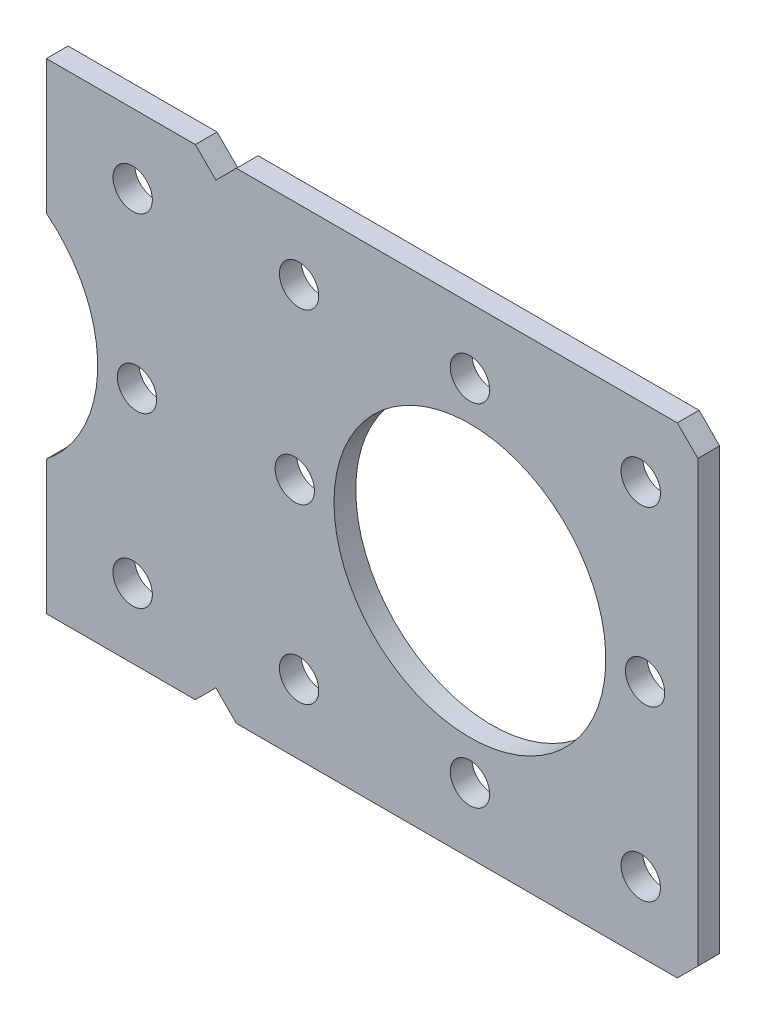
ISO-10303-21;
HEADER;
FILE_DESCRIPTION(('STEP AP214'),'2;1');
FILE_NAME('part.step','',(''),(''),'','','');
FILE_SCHEMA(('AUTOMOTIVE_DESIGN { 1 0 10303 214 1 1 1 1 }'));
ENDSEC;
DATA;
#1=APPLICATION_CONTEXT('core data for automotive mechanical design processes');
#2=APPLICATION_PROTOCOL_DEFINITION('international standard','automotive_design',2000,#1);
#3=PRODUCT_CONTEXT('',#1,'mechanical');
#4=PRODUCT('Part','Part','',(#3));
#5=PRODUCT_RELATED_PRODUCT_CATEGORY('part','',(#4));
#6=PRODUCT_DEFINITION_FORMATION('','',#4);
#7=PRODUCT_DEFINITION_CONTEXT('part definition',#1,'design');
#8=PRODUCT_DEFINITION('design','',#6,#7);
#9=PRODUCT_DEFINITION_SHAPE('','',#8);
#10=(LENGTH_UNIT() NAMED_UNIT(*) SI_UNIT(.MILLI.,.METRE.));
#11=(NAMED_UNIT(*) PLANE_ANGLE_UNIT() SI_UNIT($,.RADIAN.));
#12=(NAMED_UNIT(*) SI_UNIT($,.STERADIAN.) SOLID_ANGLE_UNIT());
#13=UNCERTAINTY_MEASURE_WITH_UNIT(LENGTH_MEASURE(1.E-05),#10,'distance_accuracy_value','');
#14=(GEOMETRIC_REPRESENTATION_CONTEXT(3) GLOBAL_UNCERTAINTY_ASSIGNED_CONTEXT((#13)) GLOBAL_UNIT_ASSIGNED_CONTEXT((#10,
#11,#12)) REPRESENTATION_CONTEXT('',''));
#15=CARTESIAN_POINT('',(0.,0.,0.));
#16=DIRECTION('',(0.,0.,1.));
#17=DIRECTION('',(1.,0.,0.));
#18=AXIS2_PLACEMENT_3D('',#15,#16,#17);
#19=CARTESIAN_POINT('',(-50.673,-25.273,2.286));
#20=DIRECTION('',(0.,0.,1.));
#21=DIRECTION('',(1.,0.,0.));
#22=AXIS2_PLACEMENT_3D('',#19,#20,#21);
#23=PLANE('',#22);
#24=DIRECTION('',(1.,0.,0.));
#25=VECTOR('',#24,1.);
#26=CARTESIAN_POINT('',(-50.673,25.273,2.286));
#27=LINE('',#26,#25);
#28=CARTESIAN_POINT('',(-2.159,25.273,2.286));
#29=VERTEX_POINT('',#28);
#30=CARTESIAN_POINT('',(-17.8181,25.273,2.286));
#31=VERTEX_POINT('',#30);
#32=EDGE_CURVE('E183',#29,#31,#27,.F.);
#33=ORIENTED_EDGE('',*,*,#32,.T.);
#34=DIRECTION('',(0.,1.,0.));
#35=VECTOR('',#34,1.);
#36=CARTESIAN_POINT('',(-17.8181,-25.273,2.286));
#37=LINE('',#36,#35);
#38=CARTESIAN_POINT('',(-17.8181,11.1848359956684,2.286));
#39=VERTEX_POINT('',#38);
#40=EDGE_CURVE('E47',#31,#39,#37,.F.);
#41=ORIENTED_EDGE('',*,*,#40,.T.);
#42=CARTESIAN_POINT('',(-26.7081,0.,2.286));
#43=DIRECTION('',(0.,0.,-1.));
#44=DIRECTION('',(-1.,0.,0.));
#45=AXIS2_PLACEMENT_3D('',#42,#43,#44);
#46=CIRCLE('',#45,14.2875);
#47=CARTESIAN_POINT('',(-17.8181,-11.1848359956684,2.286));
#48=VERTEX_POINT('',#47);
#49=EDGE_CURVE('E162',#39,#48,#46,.T.);
#50=ORIENTED_EDGE('',*,*,#49,.T.);
#51=DIRECTION('',(0.,1.,0.));
#52=VECTOR('',#51,1.);
#53=CARTESIAN_POINT('',(-17.8181,-25.273,2.286));
#54=LINE('',#53,#52);
#55=CARTESIAN_POINT('',(-17.8181,-25.273,2.286));
#56=VERTEX_POINT('',#55);
#57=EDGE_CURVE('E143',#48,#56,#54,.F.);
#58=ORIENTED_EDGE('',*,*,#57,.T.);
#59=DIRECTION('',(1.,0.,0.));
#60=VECTOR('',#59,1.);
#61=CARTESIAN_POINT('',(-50.673,-25.273,2.286));
#62=LINE('',#61,#60);
#63=CARTESIAN_POINT('',(-2.159,-25.273,2.286));
#64=VERTEX_POINT('',#63);
#65=EDGE_CURVE('E122',#56,#64,#62,.T.);
#66=ORIENTED_EDGE('',*,*,#65,.T.);
#67=DIRECTION('',(-0.707106781186546,-0.707106781186549,0.));
#68=VECTOR('',#67,1.);
#69=CARTESIAN_POINT('',(-2.159,-25.273,2.286));
#70=LINE('',#69,#68);
#71=CARTESIAN_POINT('',(0.,-23.114,2.286));
#72=VERTEX_POINT('',#71);
#73=EDGE_CURVE('E278',#64,#72,#70,.F.);
#74=ORIENTED_EDGE('',*,*,#73,.T.);
#75=DIRECTION('',(-0.707106781186546,0.707106781186549,0.));
#76=VECTOR('',#75,1.);
#77=CARTESIAN_POINT('',(0.,-23.114,2.286));
#78=LINE('',#77,#76);
#79=CARTESIAN_POINT('',(2.159,-25.273,2.286));
#80=VERTEX_POINT('',#79);
#81=EDGE_CURVE('E261',#72,#80,#78,.F.);
#82=ORIENTED_EDGE('',*,*,#81,.T.);
#83=DIRECTION('',(1.,0.,0.));
#84=VECTOR('',#83,1.);
#85=CARTESIAN_POINT('',(-50.673,-25.273,2.286));
#86=LINE('',#85,#84);
#87=CARTESIAN_POINT('',(48.514,-25.273,2.286));
#88=VERTEX_POINT('',#87);
#89=EDGE_CURVE('E260',#80,#88,#86,.T.);
#90=ORIENTED_EDGE('',*,*,#89,.T.);
#91=DIRECTION('',(-0.707106781186548,-0.707106781186548,0.));
#92=VECTOR('',#91,1.);
#93=CARTESIAN_POINT('',(50.673,-23.114,2.286));
#94=LINE('',#93,#92);
#95=CARTESIAN_POINT('',(50.673,-23.114,2.286));
#96=VERTEX_POINT('',#95);
#97=EDGE_CURVE('E249',#88,#96,#94,.F.);
#98=ORIENTED_EDGE('',*,*,#97,.T.);
#99=DIRECTION('',(0.,1.,0.));
#100=VECTOR('',#99,1.);
#101=CARTESIAN_POINT('',(50.673,25.273,2.286));
#102=LINE('',#101,#100);
#103=CARTESIAN_POINT('',(50.673,23.114,2.286));
#104=VERTEX_POINT('',#103);
#105=EDGE_CURVE('E238',#96,#104,#102,.T.);
#106=ORIENTED_EDGE('',*,*,#105,.T.);
#107=DIRECTION('',(0.707106781186548,-0.707106781186548,0.));
#108=VECTOR('',#107,1.);
#109=CARTESIAN_POINT('',(48.514,25.273,2.286));
#110=LINE('',#109,#108);
#111=CARTESIAN_POINT('',(48.514,25.273,2.286));
#112=VERTEX_POINT('',#111);
#113=EDGE_CURVE('E227',#104,#112,#110,.F.);
#114=ORIENTED_EDGE('',*,*,#113,.T.);
#115=DIRECTION('',(1.,0.,0.));
#116=VECTOR('',#115,1.);
#117=CARTESIAN_POINT('',(-50.673,25.273,2.286));
#118=LINE('',#117,#116);
#119=CARTESIAN_POINT('',(2.15899999999999,25.273,2.286));
#120=VERTEX_POINT('',#119);
#121=EDGE_CURVE('E216',#112,#120,#118,.F.);
#122=ORIENTED_EDGE('',*,*,#121,.T.);
#123=DIRECTION('',(0.707106781186546,0.707106781186549,0.));
#124=VECTOR('',#123,1.);
#125=CARTESIAN_POINT('',(0.,23.114,2.286));
#126=LINE('',#125,#124);
#127=CARTESIAN_POINT('',(0.,23.114,2.286));
#128=VERTEX_POINT('',#127);
#129=EDGE_CURVE('E205',#120,#128,#126,.F.);
#130=ORIENTED_EDGE('',*,*,#129,.T.);
#131=DIRECTION('',(0.707106781186546,-0.707106781186549,0.));
#132=VECTOR('',#131,1.);
#133=CARTESIAN_POINT('',(-2.159,25.273,2.286));
#134=LINE('',#133,#132);
#135=EDGE_CURVE('E184',#128,#29,#134,.F.);
#136=ORIENTED_EDGE('',*,*,#135,.T.);
#137=EDGE_LOOP('',(#33,#41,#50,#58,#66,#74,#82,#90,#98,#106,#114,#122,#130,#136));
#138=FACE_BOUND('',#137,.T.);
#139=CARTESIAN_POINT('',(26.7081,-18.415,2.286));
#140=DIRECTION('',(0.,0.,-1.));
#141=DIRECTION('',(-1.,0.,0.));
#142=AXIS2_PLACEMENT_3D('',#139,#140,#141);
#143=CIRCLE('',#142,2.0701);
#144=CARTESIAN_POINT('',(24.638,-18.415,2.286));
#145=VERTEX_POINT('',#144);
#146=EDGE_CURVE('E351',#145,#145,#143,.T.);
#147=ORIENTED_EDGE('',*,*,#146,.T.);
#148=EDGE_LOOP('',(#147));
#149=FACE_BOUND('',#148,.T.);
#150=CARTESIAN_POINT('',(-8.2931,-1.87350135405495E-13,2.286));
#151=DIRECTION('',(0.,0.,-1.));
#152=DIRECTION('',(-1.,0.,0.));
#153=AXIS2_PLACEMENT_3D('',#150,#151,#152);
#154=CIRCLE('',#153,2.0701);
#155=CARTESIAN_POINT('',(-10.3632,-1.87350135405495E-13,2.286));
#156=VERTEX_POINT('',#155);
#157=EDGE_CURVE('E354',#156,#156,#154,.T.);
#158=ORIENTED_EDGE('',*,*,#157,.T.);
#159=EDGE_LOOP('',(#158));
#160=FACE_BOUND('',#159,.T.);
#161=CARTESIAN_POINT('',(8.2931,-1.7347234759768E-13,2.286));
#162=DIRECTION('',(0.,0.,-1.));
#163=DIRECTION('',(-1.,0.,0.));
#164=AXIS2_PLACEMENT_3D('',#161,#162,#163);
#165=CIRCLE('',#164,2.0701);
#166=CARTESIAN_POINT('',(6.223,-1.7347234759768E-13,2.286));
#167=VERTEX_POINT('',#166);
#168=EDGE_CURVE('E357',#167,#167,#165,.T.);
#169=ORIENTED_EDGE('',*,*,#168,.T.);
#170=EDGE_LOOP('',(#169));
#171=FACE_BOUND('',#170,.T.);
#172=CARTESIAN_POINT('',(-8.7475877578617,-17.9605122421383,2.286));
#173=DIRECTION('',(0.,0.,-1.));
#174=DIRECTION('',(-1.,0.,0.));
#175=AXIS2_PLACEMENT_3D('',#172,#173,#174);
#176=CIRCLE('',#175,2.0701);
#177=CARTESIAN_POINT('',(-10.8176877578617,-17.9605122421383,2.286));
#178=VERTEX_POINT('',#177);
#179=EDGE_CURVE('E360',#178,#178,#176,.T.);
#180=ORIENTED_EDGE('',*,*,#179,.T.);
#181=EDGE_LOOP('',(#180));
#182=FACE_BOUND('',#181,.T.);
#183=CARTESIAN_POINT('',(44.6686122421383,17.9605122421382,2.286));
#184=DIRECTION('',(0.,0.,-1.));
#185=DIRECTION('',(-1.,0.,0.));
#186=AXIS2_PLACEMENT_3D('',#183,#184,#185);
#187=CIRCLE('',#186,2.0701);
#188=CARTESIAN_POINT('',(42.5985122421383,17.9605122421382,2.286));
#189=VERTEX_POINT('',#188);
#190=EDGE_CURVE('E363',#189,#189,#187,.T.);
#191=ORIENTED_EDGE('',*,*,#190,.T.);
#192=EDGE_LOOP('',(#191));
#193=FACE_BOUND('',#192,.T.);
#194=CARTESIAN_POINT('',(8.74758775786161,-17.9605122421383,2.286));
#195=DIRECTION('',(0.,0.,-1.));
#196=DIRECTION('',(-1.,0.,0.));
#197=AXIS2_PLACEMENT_3D('',#194,#195,#196);
#198=CIRCLE('',#197,2.0701);
#199=CARTESIAN_POINT('',(6.67748775786161,-17.9605122421383,2.286));
#200=VERTEX_POINT('',#199);
#201=EDGE_CURVE('E366',#200,#200,#198,.T.);
#202=ORIENTED_EDGE('',*,*,#201,.T.);
#203=EDGE_LOOP('',(#202));
#204=FACE_BOUND('',#203,.T.);
#205=CARTESIAN_POINT('',(26.7081,0.,2.286));
#206=DIRECTION('',(0.,0.,-1.));
#207=DIRECTION('',(-1.,0.,0.));
#208=AXIS2_PLACEMENT_3D('',#205,#206,#207);
#209=CIRCLE('',#208,14.2875);
#210=CARTESIAN_POINT('',(12.4206,0.,2.286));
#211=VERTEX_POINT('',#210);
#212=EDGE_CURVE('E369',#211,#211,#209,.T.);
#213=ORIENTED_EDGE('',*,*,#212,.T.);
#214=EDGE_LOOP('',(#213));
#215=FACE_BOUND('',#214,.T.);
#216=CARTESIAN_POINT('',(8.74758775786166,17.9605122421383,2.286));
#217=DIRECTION('',(0.,0.,-1.));
#218=DIRECTION('',(-1.,0.,0.));
#219=AXIS2_PLACEMENT_3D('',#216,#217,#218);
#220=CIRCLE('',#219,2.0701);
#221=CARTESIAN_POINT('',(6.67748775786166,17.9605122421383,2.286));
#222=VERTEX_POINT('',#221);
#223=EDGE_CURVE('E372',#222,#222,#220,.T.);
#224=ORIENTED_EDGE('',*,*,#223,.T.);
#225=EDGE_LOOP('',(#224));
#226=FACE_BOUND('',#225,.T.);
#227=CARTESIAN_POINT('',(44.6686122421383,-17.9605122421383,2.286));
#228=DIRECTION('',(0.,0.,-1.));
#229=DIRECTION('',(-1.,0.,0.));
#230=AXIS2_PLACEMENT_3D('',#227,#228,#229);
#231=CIRCLE('',#230,2.0701);
#232=CARTESIAN_POINT('',(42.5985122421383,-17.9605122421383,2.286));
#233=VERTEX_POINT('',#232);
#234=EDGE_CURVE('E142',#233,#233,#231,.T.);
#235=ORIENTED_EDGE('',*,*,#234,.T.);
#236=EDGE_LOOP('',(#235));
#237=FACE_BOUND('',#236,.T.);
#238=CARTESIAN_POINT('',(-8.74758775786172,17.9605122421383,2.286));
#239=DIRECTION('',(0.,0.,-1.));
#240=DIRECTION('',(-1.,0.,0.));
#241=AXIS2_PLACEMENT_3D('',#238,#239,#240);
#242=CIRCLE('',#241,2.0701);
#243=CARTESIAN_POINT('',(-10.8176877578617,17.9605122421383,2.286));
#244=VERTEX_POINT('',#243);
#245=EDGE_CURVE('E282',#244,#244,#242,.T.);
#246=ORIENTED_EDGE('',*,*,#245,.T.);
#247=EDGE_LOOP('',(#246));
#248=FACE_BOUND('',#247,.T.);
#249=CARTESIAN_POINT('',(26.7081,18.415,2.286));
#250=DIRECTION('',(0.,0.,-1.));
#251=DIRECTION('',(-1.,0.,0.));
#252=AXIS2_PLACEMENT_3D('',#249,#250,#251);
#253=CIRCLE('',#252,2.0701);
#254=CARTESIAN_POINT('',(24.638,18.415,2.286));
#255=VERTEX_POINT('',#254);
#256=EDGE_CURVE('E379',#255,#255,#253,.T.);
#257=ORIENTED_EDGE('',*,*,#256,.T.);
#258=EDGE_LOOP('',(#257));
#259=FACE_BOUND('',#258,.T.);
#260=CARTESIAN_POINT('',(45.1231,0.,2.286));
#261=DIRECTION('',(0.,0.,-1.));
#262=DIRECTION('',(-1.,0.,0.));
#263=AXIS2_PLACEMENT_3D('',#260,#261,#262);
#264=CIRCLE('',#263,2.0701);
#265=CARTESIAN_POINT('',(43.053,0.,2.286));
#266=VERTEX_POINT('',#265);
#267=EDGE_CURVE('E19',#266,#266,#264,.T.);
#268=ORIENTED_EDGE('',*,*,#267,.T.);
#269=EDGE_LOOP('',(#268));
#270=FACE_BOUND('',#269,.T.);
#271=ADVANCED_FACE('F16',(#138,#149,#160,#171,#182,#193,#204,#215,#226,#237,#248,#259,#270),#23,.T.);
#272=CARTESIAN_POINT('',(45.1231,0.,2.286));
#273=DIRECTION('',(0.,0.,-1.));
#274=DIRECTION('',(-1.,0.,0.));
#275=AXIS2_PLACEMENT_3D('',#272,#273,#274);
#276=CYLINDRICAL_SURFACE('',#275,2.0701);
#277=CARTESIAN_POINT('',(45.1231,0.,0.));
#278=DIRECTION('',(0.,0.,-1.));
#279=DIRECTION('',(-1.,0.,0.));
#280=AXIS2_PLACEMENT_3D('',#277,#278,#279);
#281=CIRCLE('',#280,2.0701);
#282=CARTESIAN_POINT('',(43.053,0.,0.));
#283=VERTEX_POINT('',#282);
#284=EDGE_CURVE('E348',#283,#283,#281,.T.);
#285=ORIENTED_EDGE('',*,*,#284,.T.);
#286=EDGE_LOOP('',(#285));
#287=FACE_BOUND('',#286,.T.);
#288=ORIENTED_EDGE('',*,*,#267,.F.);
#289=EDGE_LOOP('',(#288));
#290=FACE_BOUND('',#289,.T.);
#291=ADVANCED_FACE('F387',(#287,#290),#276,.F.);
#292=CARTESIAN_POINT('',(26.7081,18.415,2.286));
#293=DIRECTION('',(0.,0.,-1.));
#294=DIRECTION('',(-1.,0.,0.));
#295=AXIS2_PLACEMENT_3D('',#292,#293,#294);
#296=CYLINDRICAL_SURFACE('',#295,2.0701);
#297=CARTESIAN_POINT('',(26.7081,18.415,0.));
#298=DIRECTION('',(0.,0.,-1.));
#299=DIRECTION('',(-1.,0.,0.));
#300=AXIS2_PLACEMENT_3D('',#297,#298,#299);
#301=CIRCLE('',#300,2.0701);
#302=CARTESIAN_POINT('',(24.638,18.415,0.));
#303=VERTEX_POINT('',#302);
#304=EDGE_CURVE('E345',#303,#303,#301,.T.);
#305=ORIENTED_EDGE('',*,*,#304,.T.);
#306=EDGE_LOOP('',(#305));
#307=FACE_BOUND('',#306,.T.);
#308=ORIENTED_EDGE('',*,*,#256,.F.);
#309=EDGE_LOOP('',(#308));
#310=FACE_BOUND('',#309,.T.);
#311=ADVANCED_FACE('F389',(#307,#310),#296,.F.);
#312=CARTESIAN_POINT('',(-8.74758775786172,17.9605122421383,2.286));
#313=DIRECTION('',(0.,0.,-1.));
#314=DIRECTION('',(-1.,0.,0.));
#315=AXIS2_PLACEMENT_3D('',#312,#313,#314);
#316=CYLINDRICAL_SURFACE('',#315,2.0701);
#317=CARTESIAN_POINT('',(-8.74758775786172,17.9605122421383,0.));
#318=DIRECTION('',(0.,0.,-1.));
#319=DIRECTION('',(-1.,0.,0.));
#320=AXIS2_PLACEMENT_3D('',#317,#318,#319);
#321=CIRCLE('',#320,2.0701);
#322=CARTESIAN_POINT('',(-10.8176877578617,17.9605122421383,0.));
#323=VERTEX_POINT('',#322);
#324=EDGE_CURVE('E137',#323,#323,#321,.T.);
#325=ORIENTED_EDGE('',*,*,#324,.T.);
#326=EDGE_LOOP('',(#325));
#327=FACE_BOUND('',#326,.T.);
#328=ORIENTED_EDGE('',*,*,#245,.F.);
#329=EDGE_LOOP('',(#328));
#330=FACE_BOUND('',#329,.T.);
#331=ADVANCED_FACE('F396',(#327,#330),#316,.F.);
#332=CARTESIAN_POINT('',(-50.673,-25.273,2.286));
#333=DIRECTION('',(0.,1.,0.));
#334=DIRECTION('',(0.,0.,1.));
#335=AXIS2_PLACEMENT_3D('',#332,#333,#334);
#336=PLANE('',#335);
#337=DIRECTION('',(1.,0.,0.));
#338=VECTOR('',#337,1.);
#339=CARTESIAN_POINT('',(-50.673,-25.273,0.));
#340=LINE('',#339,#338);
#341=CARTESIAN_POINT('',(-17.8181,-25.273,0.));
#342=VERTEX_POINT('',#341);
#343=CARTESIAN_POINT('',(-2.15900000000001,-25.273,0.));
#344=VERTEX_POINT('',#343);
#345=EDGE_CURVE('E128',#342,#344,#340,.T.);
#346=ORIENTED_EDGE('',*,*,#345,.T.);
#347=DIRECTION('',(0.,0.,1.));
#348=VECTOR('',#347,1.);
#349=CARTESIAN_POINT('',(-2.159,-25.273,2.286));
#350=LINE('',#349,#348);
#351=EDGE_CURVE('E271',#344,#64,#350,.T.);
#352=ORIENTED_EDGE('',*,*,#351,.T.);
#353=ORIENTED_EDGE('',*,*,#65,.F.);
#354=DIRECTION('',(0.,0.,-1.));
#355=VECTOR('',#354,1.);
#356=CARTESIAN_POINT('',(-17.8181,-25.273,0.));
#357=LINE('',#356,#355);
#358=EDGE_CURVE('E139',#56,#342,#357,.T.);
#359=ORIENTED_EDGE('',*,*,#358,.T.);
#360=EDGE_LOOP('',(#346,#352,#353,#359));
#361=FACE_BOUND('',#360,.T.);
#362=ADVANCED_FACE('F140',(#361),#336,.F.);
#363=CARTESIAN_POINT('',(-2.159,-25.273,2.286));
#364=DIRECTION('',(-0.707106781186549,0.707106781186546,0.));
#365=DIRECTION('',(-0.707106781186546,-0.707106781186549,0.));
#366=AXIS2_PLACEMENT_3D('',#363,#364,#365);
#367=PLANE('',#366);
#368=DIRECTION('',(0.707106781186547,0.707106781186548,0.));
#369=VECTOR('',#368,1.);
#370=CARTESIAN_POINT('',(-2.159,-25.273,0.));
#371=LINE('',#370,#369);
#372=CARTESIAN_POINT('',(0.,-23.114,0.));
#373=VERTEX_POINT('',#372);
#374=EDGE_CURVE('E136',#344,#373,#371,.T.);
#375=ORIENTED_EDGE('',*,*,#374,.T.);
#376=DIRECTION('',(0.,0.,1.));
#377=VECTOR('',#376,1.);
#378=CARTESIAN_POINT('',(0.,-23.114,2.286));
#379=LINE('',#378,#377);
#380=EDGE_CURVE('E268',#373,#72,#379,.T.);
#381=ORIENTED_EDGE('',*,*,#380,.T.);
#382=ORIENTED_EDGE('',*,*,#73,.F.);
#383=ORIENTED_EDGE('',*,*,#351,.F.);
#384=EDGE_LOOP('',(#375,#381,#382,#383));
#385=FACE_BOUND('',#384,.T.);
#386=ADVANCED_FACE('F488',(#385),#367,.F.);
#387=CARTESIAN_POINT('',(0.,-23.114,2.286));
#388=DIRECTION('',(0.707106781186549,0.707106781186546,0.));
#389=DIRECTION('',(-0.707106781186546,0.707106781186549,0.));
#390=AXIS2_PLACEMENT_3D('',#387,#388,#389);
#391=PLANE('',#390);
#392=ORIENTED_EDGE('',*,*,#380,.F.);
#393=DIRECTION('',(0.707106781186546,-0.707106781186549,0.));
#394=VECTOR('',#393,1.);
#395=CARTESIAN_POINT('',(0.,-23.114,0.));
#396=LINE('',#395,#394);
#397=CARTESIAN_POINT('',(2.159,-25.273,0.));
#398=VERTEX_POINT('',#397);
#399=EDGE_CURVE('E254',#373,#398,#396,.T.);
#400=ORIENTED_EDGE('',*,*,#399,.T.);
#401=DIRECTION('',(0.,0.,1.));
#402=VECTOR('',#401,1.);
#403=CARTESIAN_POINT('',(2.159,-25.273,2.286));
#404=LINE('',#403,#402);
#405=EDGE_CURVE('E257',#398,#80,#404,.T.);
#406=ORIENTED_EDGE('',*,*,#405,.T.);
#407=ORIENTED_EDGE('',*,*,#81,.F.);
#408=EDGE_LOOP('',(#392,#400,#406,#407));
#409=FACE_BOUND('',#408,.T.);
#410=ADVANCED_FACE('F484',(#409),#391,.F.);
#411=CARTESIAN_POINT('',(-50.673,-25.273,2.286));
#412=DIRECTION('',(0.,1.,0.));
#413=DIRECTION('',(0.,0.,1.));
#414=AXIS2_PLACEMENT_3D('',#411,#412,#413);
#415=PLANE('',#414);
#416=DIRECTION('',(0.,0.,1.));
#417=VECTOR('',#416,1.);
#418=CARTESIAN_POINT('',(48.514,-25.273,2.286));
#419=LINE('',#418,#417);
#420=CARTESIAN_POINT('',(48.514,-25.273,0.));
#421=VERTEX_POINT('',#420);
#422=EDGE_CURVE('E239',#421,#88,#419,.T.);
#423=ORIENTED_EDGE('',*,*,#422,.T.);
#424=ORIENTED_EDGE('',*,*,#89,.F.);
#425=ORIENTED_EDGE('',*,*,#405,.F.);
#426=DIRECTION('',(1.,0.,0.));
#427=VECTOR('',#426,1.);
#428=CARTESIAN_POINT('',(-50.673,-25.273,0.));
#429=LINE('',#428,#427);
#430=EDGE_CURVE('E244',#398,#421,#429,.T.);
#431=ORIENTED_EDGE('',*,*,#430,.T.);
#432=EDGE_LOOP('',(#423,#424,#425,#431));
#433=FACE_BOUND('',#432,.T.);
#434=ADVANCED_FACE('F480',(#433),#415,.F.);
#435=CARTESIAN_POINT('',(50.673,-23.114,2.286));
#436=DIRECTION('',(-0.707106781186548,0.707106781186548,0.));
#437=DIRECTION('',(-0.707106781186548,-0.707106781186548,0.));
#438=AXIS2_PLACEMENT_3D('',#435,#436,#437);
#439=PLANE('',#438);
#440=DIRECTION('',(0.707106781186548,0.707106781186547,0.));
#441=VECTOR('',#440,1.);
#442=CARTESIAN_POINT('',(48.514,-25.273,0.));
#443=LINE('',#442,#441);
#444=CARTESIAN_POINT('',(50.673,-23.114,0.));
#445=VERTEX_POINT('',#444);
#446=EDGE_CURVE('E232',#421,#445,#443,.T.);
#447=ORIENTED_EDGE('',*,*,#446,.T.);
#448=DIRECTION('',(0.,0.,1.));
#449=VECTOR('',#448,1.);
#450=CARTESIAN_POINT('',(50.673,-23.114,2.286));
#451=LINE('',#450,#449);
#452=EDGE_CURVE('E235',#445,#96,#451,.T.);
#453=ORIENTED_EDGE('',*,*,#452,.T.);
#454=ORIENTED_EDGE('',*,*,#97,.F.);
#455=ORIENTED_EDGE('',*,*,#422,.F.);
#456=EDGE_LOOP('',(#447,#453,#454,#455));
#457=FACE_BOUND('',#456,.T.);
#458=ADVANCED_FACE('F476',(#457),#439,.F.);
#459=CARTESIAN_POINT('',(50.673,25.273,2.286));
#460=DIRECTION('',(-1.,0.,0.));
#461=DIRECTION('',(0.,0.,1.));
#462=AXIS2_PLACEMENT_3D('',#459,#460,#461);
#463=PLANE('',#462);
#464=ORIENTED_EDGE('',*,*,#105,.F.);
#465=ORIENTED_EDGE('',*,*,#452,.F.);
#466=DIRECTION('',(0.,1.,0.));
#467=VECTOR('',#466,1.);
#468=CARTESIAN_POINT('',(50.673,-25.273,0.));
#469=LINE('',#468,#467);
#470=CARTESIAN_POINT('',(50.673,23.114,0.));
#471=VERTEX_POINT('',#470);
#472=EDGE_CURVE('E222',#445,#471,#469,.T.);
#473=ORIENTED_EDGE('',*,*,#472,.T.);
#474=DIRECTION('',(0.,0.,1.));
#475=VECTOR('',#474,1.);
#476=CARTESIAN_POINT('',(50.673,23.114,2.286));
#477=LINE('',#476,#475);
#478=EDGE_CURVE('E217',#471,#104,#477,.T.);
#479=ORIENTED_EDGE('',*,*,#478,.T.);
#480=EDGE_LOOP('',(#464,#465,#473,#479));
#481=FACE_BOUND('',#480,.T.);
#482=ADVANCED_FACE('F472',(#481),#463,.F.);
#483=CARTESIAN_POINT('',(48.514,25.273,2.286));
#484=DIRECTION('',(-0.707106781186548,-0.707106781186548,0.));
#485=DIRECTION('',(0.707106781186548,-0.707106781186548,0.));
#486=AXIS2_PLACEMENT_3D('',#483,#484,#485);
#487=PLANE('',#486);
#488=DIRECTION('',(-0.707106781186548,0.707106781186548,0.));
#489=VECTOR('',#488,1.);
#490=CARTESIAN_POINT('',(50.673,23.114,0.));
#491=LINE('',#490,#489);
#492=CARTESIAN_POINT('',(48.514,25.273,0.));
#493=VERTEX_POINT('',#492);
#494=EDGE_CURVE('E210',#471,#493,#491,.T.);
#495=ORIENTED_EDGE('',*,*,#494,.T.);
#496=DIRECTION('',(0.,0.,-1.));
#497=VECTOR('',#496,1.);
#498=CARTESIAN_POINT('',(48.514,25.273,2.286));
#499=LINE('',#498,#497);
#500=EDGE_CURVE('E213',#493,#112,#499,.F.);
#501=ORIENTED_EDGE('',*,*,#500,.T.);
#502=ORIENTED_EDGE('',*,*,#113,.F.);
#503=ORIENTED_EDGE('',*,*,#478,.F.);
#504=EDGE_LOOP('',(#495,#501,#502,#503));
#505=FACE_BOUND('',#504,.T.);
#506=ADVANCED_FACE('F468',(#505),#487,.F.);
#507=CARTESIAN_POINT('',(-50.673,25.273,2.286));
#508=DIRECTION('',(0.,-1.,0.));
#509=DIRECTION('',(0.,0.,-1.));
#510=AXIS2_PLACEMENT_3D('',#507,#508,#509);
#511=PLANE('',#510);
#512=ORIENTED_EDGE('',*,*,#500,.F.);
#513=DIRECTION('',(1.,0.,0.));
#514=VECTOR('',#513,1.);
#515=CARTESIAN_POINT('',(-50.673,25.273,0.));
#516=LINE('',#515,#514);
#517=CARTESIAN_POINT('',(2.15899999999999,25.273,0.));
#518=VERTEX_POINT('',#517);
#519=EDGE_CURVE('E200',#493,#518,#516,.F.);
#520=ORIENTED_EDGE('',*,*,#519,.T.);
#521=DIRECTION('',(0.,0.,1.));
#522=VECTOR('',#521,1.);
#523=CARTESIAN_POINT('',(2.15899999999999,25.273,2.286));
#524=LINE('',#523,#522);
#525=EDGE_CURVE('E195',#518,#120,#524,.T.);
#526=ORIENTED_EDGE('',*,*,#525,.T.);
#527=ORIENTED_EDGE('',*,*,#121,.F.);
#528=EDGE_LOOP('',(#512,#520,#526,#527));
#529=FACE_BOUND('',#528,.T.);
#530=ADVANCED_FACE('F464',(#529),#511,.F.);
#531=CARTESIAN_POINT('',(0.,23.114,2.286));
#532=DIRECTION('',(0.707106781186549,-0.707106781186546,0.));
#533=DIRECTION('',(0.707106781186546,0.707106781186549,0.));
#534=AXIS2_PLACEMENT_3D('',#531,#532,#533);
#535=PLANE('',#534);
#536=DIRECTION('',(-0.707106781186546,-0.707106781186549,0.));
#537=VECTOR('',#536,1.);
#538=CARTESIAN_POINT('',(2.15899999999999,25.273,0.));
#539=LINE('',#538,#537);
#540=CARTESIAN_POINT('',(0.,23.114,0.));
#541=VERTEX_POINT('',#540);
#542=EDGE_CURVE('E189',#518,#541,#539,.T.);
#543=ORIENTED_EDGE('',*,*,#542,.T.);
#544=DIRECTION('',(0.,0.,1.));
#545=VECTOR('',#544,1.);
#546=CARTESIAN_POINT('',(0.,23.114,2.286));
#547=LINE('',#546,#545);
#548=EDGE_CURVE('E192',#541,#128,#547,.T.);
#549=ORIENTED_EDGE('',*,*,#548,.T.);
#550=ORIENTED_EDGE('',*,*,#129,.F.);
#551=ORIENTED_EDGE('',*,*,#525,.F.);
#552=EDGE_LOOP('',(#543,#549,#550,#551));
#553=FACE_BOUND('',#552,.T.);
#554=ADVANCED_FACE('F460',(#553),#535,.F.);
#555=CARTESIAN_POINT('',(-2.159,25.273,2.286));
#556=DIRECTION('',(-0.707106781186549,-0.707106781186546,0.));
#557=DIRECTION('',(0.707106781186546,-0.707106781186549,0.));
#558=AXIS2_PLACEMENT_3D('',#555,#556,#557);
#559=PLANE('',#558);
#560=ORIENTED_EDGE('',*,*,#548,.F.);
#561=DIRECTION('',(-0.707106781186546,0.707106781186549,0.));
#562=VECTOR('',#561,1.);
#563=CARTESIAN_POINT('',(0.,23.114,0.));
#564=LINE('',#563,#562);
#565=CARTESIAN_POINT('',(-2.159,25.273,0.));
#566=VERTEX_POINT('',#565);
#567=EDGE_CURVE('E177',#541,#566,#564,.T.);
#568=ORIENTED_EDGE('',*,*,#567,.T.);
#569=DIRECTION('',(0.,0.,-1.));
#570=VECTOR('',#569,1.);
#571=CARTESIAN_POINT('',(-2.159,25.273,2.286));
#572=LINE('',#571,#570);
#573=EDGE_CURVE('E180',#566,#29,#572,.F.);
#574=ORIENTED_EDGE('',*,*,#573,.T.);
#575=ORIENTED_EDGE('',*,*,#135,.F.);
#576=EDGE_LOOP('',(#560,#568,#574,#575));
#577=FACE_BOUND('',#576,.T.);
#578=ADVANCED_FACE('F456',(#577),#559,.F.);
#579=CARTESIAN_POINT('',(-50.673,25.273,2.286));
#580=DIRECTION('',(0.,-1.,0.));
#581=DIRECTION('',(0.,0.,-1.));
#582=AXIS2_PLACEMENT_3D('',#579,#580,#581);
#583=PLANE('',#582);
#584=ORIENTED_EDGE('',*,*,#32,.F.);
#585=ORIENTED_EDGE('',*,*,#573,.F.);
#586=DIRECTION('',(1.,0.,0.));
#587=VECTOR('',#586,1.);
#588=CARTESIAN_POINT('',(-50.673,25.273,0.));
#589=LINE('',#588,#587);
#590=CARTESIAN_POINT('',(-17.8181,25.273,0.));
#591=VERTEX_POINT('',#590);
#592=EDGE_CURVE('E159',#566,#591,#589,.F.);
#593=ORIENTED_EDGE('',*,*,#592,.T.);
#594=DIRECTION('',(0.,0.,-1.));
#595=VECTOR('',#594,1.);
#596=CARTESIAN_POINT('',(-17.8181,25.273,0.));
#597=LINE('',#596,#595);
#598=EDGE_CURVE('E170',#591,#31,#597,.F.);
#599=ORIENTED_EDGE('',*,*,#598,.T.);
#600=EDGE_LOOP('',(#584,#585,#593,#599));
#601=FACE_BOUND('',#600,.T.);
#602=ADVANCED_FACE('F453',(#601),#583,.F.);
#603=CARTESIAN_POINT('',(-17.8181,-25.273,0.));
#604=DIRECTION('',(1.,0.,0.));
#605=DIRECTION('',(0.,0.,-1.));
#606=AXIS2_PLACEMENT_3D('',#603,#604,#605);
#607=PLANE('',#606);
#608=DIRECTION('',(0.,1.,0.));
#609=VECTOR('',#608,1.);
#610=CARTESIAN_POINT('',(-17.8181,-25.273,0.));
#611=LINE('',#610,#609);
#612=CARTESIAN_POINT('',(-17.8181,11.1848359956684,0.));
#613=VERTEX_POINT('',#612);
#614=EDGE_CURVE('E152',#591,#613,#611,.F.);
#615=ORIENTED_EDGE('',*,*,#614,.T.);
#616=DIRECTION('',(0.,0.,-1.));
#617=VECTOR('',#616,1.);
#618=CARTESIAN_POINT('',(-17.8181,11.1848359956684,2.286));
#619=LINE('',#618,#617);
#620=EDGE_CURVE('E168',#613,#39,#619,.F.);
#621=ORIENTED_EDGE('',*,*,#620,.T.);
#622=ORIENTED_EDGE('',*,*,#40,.F.);
#623=ORIENTED_EDGE('',*,*,#598,.F.);
#624=EDGE_LOOP('',(#615,#621,#622,#623));
#625=FACE_BOUND('',#624,.T.);
#626=ADVANCED_FACE('F449',(#625),#607,.F.);
#627=CARTESIAN_POINT('',(-26.7081,0.,2.286));
#628=DIRECTION('',(0.,0.,-1.));
#629=DIRECTION('',(-1.,0.,0.));
#630=AXIS2_PLACEMENT_3D('',#627,#628,#629);
#631=CYLINDRICAL_SURFACE('',#630,14.2875);
#632=ORIENTED_EDGE('',*,*,#49,.F.);
#633=ORIENTED_EDGE('',*,*,#620,.F.);
#634=CARTESIAN_POINT('',(-26.7081,0.,0.));
#635=DIRECTION('',(0.,0.,-1.));
#636=DIRECTION('',(-1.,0.,0.));
#637=AXIS2_PLACEMENT_3D('',#634,#635,#636);
#638=CIRCLE('',#637,14.2875);
#639=CARTESIAN_POINT('',(-17.8181,-11.1848359956684,0.));
#640=VERTEX_POINT('',#639);
#641=EDGE_CURVE('E147',#613,#640,#638,.T.);
#642=ORIENTED_EDGE('',*,*,#641,.T.);
#643=DIRECTION('',(0.,0.,-1.));
#644=VECTOR('',#643,1.);
#645=CARTESIAN_POINT('',(-17.8181,-11.1848359956684,0.));
#646=LINE('',#645,#644);
#647=EDGE_CURVE('E34',#640,#48,#646,.F.);
#648=ORIENTED_EDGE('',*,*,#647,.T.);
#649=EDGE_LOOP('',(#632,#633,#642,#648));
#650=FACE_BOUND('',#649,.T.);
#651=ADVANCED_FACE('F446',(#650),#631,.F.);
#652=CARTESIAN_POINT('',(-17.8181,-25.273,0.));
#653=DIRECTION('',(1.,0.,0.));
#654=DIRECTION('',(0.,0.,-1.));
#655=AXIS2_PLACEMENT_3D('',#652,#653,#654);
#656=PLANE('',#655);
#657=ORIENTED_EDGE('',*,*,#57,.F.);
#658=ORIENTED_EDGE('',*,*,#647,.F.);
#659=DIRECTION('',(0.,1.,0.));
#660=VECTOR('',#659,1.);
#661=CARTESIAN_POINT('',(-17.8181,-25.273,0.));
#662=LINE('',#661,#660);
#663=EDGE_CURVE('E132',#640,#342,#662,.F.);
#664=ORIENTED_EDGE('',*,*,#663,.T.);
#665=ORIENTED_EDGE('',*,*,#358,.F.);
#666=EDGE_LOOP('',(#657,#658,#664,#665));
#667=FACE_BOUND('',#666,.T.);
#668=ADVANCED_FACE('F145',(#667),#656,.F.);
#669=CARTESIAN_POINT('',(44.6686122421383,-17.9605122421383,2.286));
#670=DIRECTION('',(0.,0.,-1.));
#671=DIRECTION('',(-1.,0.,0.));
#672=AXIS2_PLACEMENT_3D('',#669,#670,#671);
#673=CYLINDRICAL_SURFACE('',#672,2.0701);
#674=CARTESIAN_POINT('',(44.6686122421383,-17.9605122421383,0.));
#675=DIRECTION('',(0.,0.,-1.));
#676=DIRECTION('',(-1.,0.,0.));
#677=AXIS2_PLACEMENT_3D('',#674,#675,#676);
#678=CIRCLE('',#677,2.0701);
#679=CARTESIAN_POINT('',(42.5985122421383,-17.9605122421383,0.));
#680=VERTEX_POINT('',#679);
#681=EDGE_CURVE('E146',#680,#680,#678,.T.);
#682=ORIENTED_EDGE('',*,*,#681,.T.);
#683=EDGE_LOOP('',(#682));
#684=FACE_BOUND('',#683,.T.);
#685=ORIENTED_EDGE('',*,*,#234,.F.);
#686=EDGE_LOOP('',(#685));
#687=FACE_BOUND('',#686,.T.);
#688=ADVANCED_FACE('F439',(#684,#687),#673,.F.);
#689=CARTESIAN_POINT('',(8.74758775786166,17.9605122421383,2.286));
#690=DIRECTION('',(0.,0.,-1.));
#691=DIRECTION('',(-1.,0.,0.));
#692=AXIS2_PLACEMENT_3D('',#689,#690,#691);
#693=CYLINDRICAL_SURFACE('',#692,2.0701);
#694=CARTESIAN_POINT('',(8.74758775786166,17.9605122421383,0.));
#695=DIRECTION('',(0.,0.,-1.));
#696=DIRECTION('',(-1.,0.,0.));
#697=AXIS2_PLACEMENT_3D('',#694,#695,#696);
#698=CIRCLE('',#697,2.0701);
#699=CARTESIAN_POINT('',(6.67748775786166,17.9605122421383,0.));
#700=VERTEX_POINT('',#699);
#701=EDGE_CURVE('E150',#700,#700,#698,.T.);
#702=ORIENTED_EDGE('',*,*,#701,.T.);
#703=EDGE_LOOP('',(#702));
#704=FACE_BOUND('',#703,.T.);
#705=ORIENTED_EDGE('',*,*,#223,.F.);
#706=EDGE_LOOP('',(#705));
#707=FACE_BOUND('',#706,.T.);
#708=ADVANCED_FACE('F435',(#704,#707),#693,.F.);
#709=CARTESIAN_POINT('',(26.7081,0.,2.286));
#710=DIRECTION('',(0.,0.,-1.));
#711=DIRECTION('',(-1.,0.,0.));
#712=AXIS2_PLACEMENT_3D('',#709,#710,#711);
#713=CYLINDRICAL_SURFACE('',#712,14.2875);
#714=CARTESIAN_POINT('',(26.7081,0.,0.));
#715=DIRECTION('',(0.,0.,-1.));
#716=DIRECTION('',(-1.,0.,0.));
#717=AXIS2_PLACEMENT_3D('',#714,#715,#716);
#718=CIRCLE('',#717,14.2875);
#719=CARTESIAN_POINT('',(12.4206,0.,0.));
#720=VERTEX_POINT('',#719);
#721=EDGE_CURVE('E338',#720,#720,#718,.T.);
#722=ORIENTED_EDGE('',*,*,#721,.T.);
#723=EDGE_LOOP('',(#722));
#724=FACE_BOUND('',#723,.T.);
#725=ORIENTED_EDGE('',*,*,#212,.F.);
#726=EDGE_LOOP('',(#725));
#727=FACE_BOUND('',#726,.T.);
#728=ADVANCED_FACE('F431',(#724,#727),#713,.F.);
#729=CARTESIAN_POINT('',(8.74758775786161,-17.9605122421383,2.286));
#730=DIRECTION('',(0.,0.,-1.));
#731=DIRECTION('',(-1.,0.,0.));
#732=AXIS2_PLACEMENT_3D('',#729,#730,#731);
#733=CYLINDRICAL_SURFACE('',#732,2.0701);
#734=CARTESIAN_POINT('',(8.74758775786161,-17.9605122421383,0.));
#735=DIRECTION('',(0.,0.,-1.));
#736=DIRECTION('',(-1.,0.,0.));
#737=AXIS2_PLACEMENT_3D('',#734,#735,#736);
#738=CIRCLE('',#737,2.0701);
#739=CARTESIAN_POINT('',(6.67748775786161,-17.9605122421383,0.));
#740=VERTEX_POINT('',#739);
#741=EDGE_CURVE('E335',#740,#740,#738,.T.);
#742=ORIENTED_EDGE('',*,*,#741,.T.);
#743=EDGE_LOOP('',(#742));
#744=FACE_BOUND('',#743,.T.);
#745=ORIENTED_EDGE('',*,*,#201,.F.);
#746=EDGE_LOOP('',(#745));
#747=FACE_BOUND('',#746,.T.);
#748=ADVANCED_FACE('F427',(#744,#747),#733,.F.);
#749=CARTESIAN_POINT('',(44.6686122421383,17.9605122421382,2.286));
#750=DIRECTION('',(0.,0.,-1.));
#751=DIRECTION('',(-1.,0.,0.));
#752=AXIS2_PLACEMENT_3D('',#749,#750,#751);
#753=CYLINDRICAL_SURFACE('',#752,2.0701);
#754=CARTESIAN_POINT('',(44.6686122421383,17.9605122421382,0.));
#755=DIRECTION('',(0.,0.,-1.));
#756=DIRECTION('',(-1.,0.,0.));
#757=AXIS2_PLACEMENT_3D('',#754,#755,#756);
#758=CIRCLE('',#757,2.0701);
#759=CARTESIAN_POINT('',(42.5985122421383,17.9605122421382,0.));
#760=VERTEX_POINT('',#759);
#761=EDGE_CURVE('E332',#760,#760,#758,.T.);
#762=ORIENTED_EDGE('',*,*,#761,.T.);
#763=EDGE_LOOP('',(#762));
#764=FACE_BOUND('',#763,.T.);
#765=ORIENTED_EDGE('',*,*,#190,.F.);
#766=EDGE_LOOP('',(#765));
#767=FACE_BOUND('',#766,.T.);
#768=ADVANCED_FACE('F423',(#764,#767),#753,.F.);
#769=CARTESIAN_POINT('',(-8.7475877578617,-17.9605122421383,2.286));
#770=DIRECTION('',(0.,0.,-1.));
#771=DIRECTION('',(-1.,0.,0.));
#772=AXIS2_PLACEMENT_3D('',#769,#770,#771);
#773=CYLINDRICAL_SURFACE('',#772,2.0701);
#774=CARTESIAN_POINT('',(-8.7475877578617,-17.9605122421383,0.));
#775=DIRECTION('',(0.,0.,-1.));
#776=DIRECTION('',(-1.,0.,0.));
#777=AXIS2_PLACEMENT_3D('',#774,#775,#776);
#778=CIRCLE('',#777,2.0701);
#779=CARTESIAN_POINT('',(-10.8176877578617,-17.9605122421383,0.));
#780=VERTEX_POINT('',#779);
#781=EDGE_CURVE('E329',#780,#780,#778,.T.);
#782=ORIENTED_EDGE('',*,*,#781,.T.);
#783=EDGE_LOOP('',(#782));
#784=FACE_BOUND('',#783,.T.);
#785=ORIENTED_EDGE('',*,*,#179,.F.);
#786=EDGE_LOOP('',(#785));
#787=FACE_BOUND('',#786,.T.);
#788=ADVANCED_FACE('F419',(#784,#787),#773,.F.);
#789=CARTESIAN_POINT('',(8.2931,-1.7347234759768E-13,2.286));
#790=DIRECTION('',(0.,0.,-1.));
#791=DIRECTION('',(-1.,0.,0.));
#792=AXIS2_PLACEMENT_3D('',#789,#790,#791);
#793=CYLINDRICAL_SURFACE('',#792,2.0701);
#794=CARTESIAN_POINT('',(8.2931,-1.7347234759768E-13,0.));
#795=DIRECTION('',(0.,0.,-1.));
#796=DIRECTION('',(-1.,0.,0.));
#797=AXIS2_PLACEMENT_3D('',#794,#795,#796);
#798=CIRCLE('',#797,2.0701);
#799=CARTESIAN_POINT('',(6.223,-1.7347234759768E-13,0.));
#800=VERTEX_POINT('',#799);
#801=EDGE_CURVE('E326',#800,#800,#798,.T.);
#802=ORIENTED_EDGE('',*,*,#801,.T.);
#803=EDGE_LOOP('',(#802));
#804=FACE_BOUND('',#803,.T.);
#805=ORIENTED_EDGE('',*,*,#168,.F.);
#806=EDGE_LOOP('',(#805));
#807=FACE_BOUND('',#806,.T.);
#808=ADVANCED_FACE('F415',(#804,#807),#793,.F.);
#809=CARTESIAN_POINT('',(-8.2931,-1.87350135405495E-13,2.286));
#810=DIRECTION('',(0.,0.,-1.));
#811=DIRECTION('',(-1.,0.,0.));
#812=AXIS2_PLACEMENT_3D('',#809,#810,#811);
#813=CYLINDRICAL_SURFACE('',#812,2.0701);
#814=CARTESIAN_POINT('',(-8.2931,-1.87350135405495E-13,0.));
#815=DIRECTION('',(0.,0.,-1.));
#816=DIRECTION('',(-1.,0.,0.));
#817=AXIS2_PLACEMENT_3D('',#814,#815,#816);
#818=CIRCLE('',#817,2.0701);
#819=CARTESIAN_POINT('',(-10.3632,-1.87350135405495E-13,0.));
#820=VERTEX_POINT('',#819);
#821=EDGE_CURVE('E25',#820,#820,#818,.T.);
#822=ORIENTED_EDGE('',*,*,#821,.T.);
#823=EDGE_LOOP('',(#822));
#824=FACE_BOUND('',#823,.T.);
#825=ORIENTED_EDGE('',*,*,#157,.F.);
#826=EDGE_LOOP('',(#825));
#827=FACE_BOUND('',#826,.T.);
#828=ADVANCED_FACE('F407',(#824,#827),#813,.F.);
#829=CARTESIAN_POINT('',(26.7081,-18.415,2.286));
#830=DIRECTION('',(0.,0.,-1.));
#831=DIRECTION('',(-1.,0.,0.));
#832=AXIS2_PLACEMENT_3D('',#829,#830,#831);
#833=CYLINDRICAL_SURFACE('',#832,2.0701);
#834=CARTESIAN_POINT('',(26.7081,-18.415,0.));
#835=DIRECTION('',(0.,0.,-1.));
#836=DIRECTION('',(-1.,0.,0.));
#837=AXIS2_PLACEMENT_3D('',#834,#835,#836);
#838=CIRCLE('',#837,2.0701);
#839=CARTESIAN_POINT('',(24.638,-18.415,0.));
#840=VERTEX_POINT('',#839);
#841=EDGE_CURVE('E11',#840,#840,#838,.T.);
#842=ORIENTED_EDGE('',*,*,#841,.T.);
#843=EDGE_LOOP('',(#842));
#844=FACE_BOUND('',#843,.T.);
#845=ORIENTED_EDGE('',*,*,#146,.F.);
#846=EDGE_LOOP('',(#845));
#847=FACE_BOUND('',#846,.T.);
#848=ADVANCED_FACE('F401',(#844,#847),#833,.F.);
#849=CARTESIAN_POINT('',(-50.673,-25.273,0.));
#850=DIRECTION('',(0.,0.,1.));
#851=DIRECTION('',(1.,0.,0.));
#852=AXIS2_PLACEMENT_3D('',#849,#850,#851);
#853=PLANE('',#852);
#854=ORIENTED_EDGE('',*,*,#841,.F.);
#855=EDGE_LOOP('',(#854));
#856=FACE_BOUND('',#855,.T.);
#857=ORIENTED_EDGE('',*,*,#821,.F.);
#858=EDGE_LOOP('',(#857));
#859=FACE_BOUND('',#858,.T.);
#860=ORIENTED_EDGE('',*,*,#801,.F.);
#861=EDGE_LOOP('',(#860));
#862=FACE_BOUND('',#861,.T.);
#863=ORIENTED_EDGE('',*,*,#781,.F.);
#864=EDGE_LOOP('',(#863));
#865=FACE_BOUND('',#864,.T.);
#866=ORIENTED_EDGE('',*,*,#761,.F.);
#867=EDGE_LOOP('',(#866));
#868=FACE_BOUND('',#867,.T.);
#869=ORIENTED_EDGE('',*,*,#741,.F.);
#870=EDGE_LOOP('',(#869));
#871=FACE_BOUND('',#870,.T.);
#872=ORIENTED_EDGE('',*,*,#721,.F.);
#873=EDGE_LOOP('',(#872));
#874=FACE_BOUND('',#873,.T.);
#875=ORIENTED_EDGE('',*,*,#701,.F.);
#876=EDGE_LOOP('',(#875));
#877=FACE_BOUND('',#876,.T.);
#878=ORIENTED_EDGE('',*,*,#681,.F.);
#879=EDGE_LOOP('',(#878));
#880=FACE_BOUND('',#879,.T.);
#881=ORIENTED_EDGE('',*,*,#641,.F.);
#882=ORIENTED_EDGE('',*,*,#614,.F.);
#883=ORIENTED_EDGE('',*,*,#592,.F.);
#884=ORIENTED_EDGE('',*,*,#567,.F.);
#885=ORIENTED_EDGE('',*,*,#542,.F.);
#886=ORIENTED_EDGE('',*,*,#519,.F.);
#887=ORIENTED_EDGE('',*,*,#494,.F.);
#888=ORIENTED_EDGE('',*,*,#472,.F.);
#889=ORIENTED_EDGE('',*,*,#446,.F.);
#890=ORIENTED_EDGE('',*,*,#430,.F.);
#891=ORIENTED_EDGE('',*,*,#399,.F.);
#892=ORIENTED_EDGE('',*,*,#374,.F.);
#893=ORIENTED_EDGE('',*,*,#345,.F.);
#894=ORIENTED_EDGE('',*,*,#663,.F.);
#895=EDGE_LOOP('',(#881,#882,#883,#884,#885,#886,#887,#888,#889,#890,#891,#892,#893,#894));
#896=FACE_BOUND('',#895,.T.);
#897=ORIENTED_EDGE('',*,*,#324,.F.);
#898=EDGE_LOOP('',(#897));
#899=FACE_BOUND('',#898,.T.);
#900=ORIENTED_EDGE('',*,*,#304,.F.);
#901=EDGE_LOOP('',(#900));
#902=FACE_BOUND('',#901,.T.);
#903=ORIENTED_EDGE('',*,*,#284,.F.);
#904=EDGE_LOOP('',(#903));
#905=FACE_BOUND('',#904,.T.);
#906=ADVANCED_FACE('F130',(#856,#859,#862,#865,#868,#871,#874,#877,#880,#896,#899,#902,#905),
#853,.F.);
#907=CLOSED_SHELL('',(#271,#291,#311,#331,#362,#386,#410,#434,#458,#482,#506,#530,#554,#578,
#602,#626,#651,#668,#688,#708,#728,#748,#768,#788,#808,#828,#848,#906));
#908=MANIFOLD_SOLID_BREP('B1',#907);
#909=ADVANCED_BREP_SHAPE_REPRESENTATION('',(#18,#908),#14);
#910=SHAPE_DEFINITION_REPRESENTATION(#9,#909);
ENDSEC;
END-ISO-10303-21;
